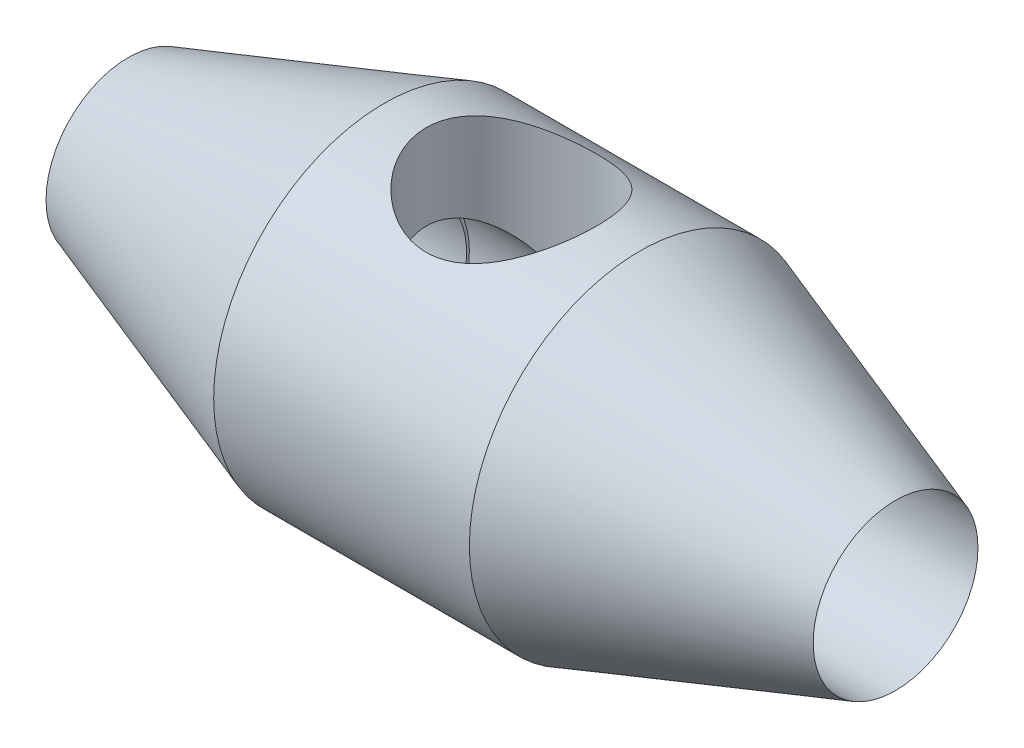
ISO-10303-21;
HEADER;
FILE_DESCRIPTION(('STEP AP214'),'2;1');
FILE_NAME('part.step','',(''),(''),'','','');
FILE_SCHEMA(('AUTOMOTIVE_DESIGN { 1 0 10303 214 1 1 1 1 }'));
ENDSEC;
DATA;
#1=APPLICATION_CONTEXT('core data for automotive mechanical design processes');
#2=APPLICATION_PROTOCOL_DEFINITION('international standard','automotive_design',2000,#1);
#3=PRODUCT_CONTEXT('',#1,'mechanical');
#4=PRODUCT('Part','Part','',(#3));
#5=PRODUCT_RELATED_PRODUCT_CATEGORY('part','',(#4));
#6=PRODUCT_DEFINITION_FORMATION('','',#4);
#7=PRODUCT_DEFINITION_CONTEXT('part definition',#1,'design');
#8=PRODUCT_DEFINITION('design','',#6,#7);
#9=PRODUCT_DEFINITION_SHAPE('','',#8);
#10=(LENGTH_UNIT() NAMED_UNIT(*) SI_UNIT(.MILLI.,.METRE.));
#11=(NAMED_UNIT(*) PLANE_ANGLE_UNIT() SI_UNIT($,.RADIAN.));
#12=(NAMED_UNIT(*) SI_UNIT($,.STERADIAN.) SOLID_ANGLE_UNIT());
#13=UNCERTAINTY_MEASURE_WITH_UNIT(LENGTH_MEASURE(1.E-05),#10,'distance_accuracy_value','');
#14=(GEOMETRIC_REPRESENTATION_CONTEXT(3) GLOBAL_UNCERTAINTY_ASSIGNED_CONTEXT((#13)) GLOBAL_UNIT_ASSIGNED_CONTEXT((#10,
#11,#12)) REPRESENTATION_CONTEXT('',''));
#15=CARTESIAN_POINT('',(0.,0.,0.));
#16=DIRECTION('',(0.,0.,1.));
#17=DIRECTION('',(1.,0.,0.));
#18=AXIS2_PLACEMENT_3D('',#15,#16,#17);
#19=CARTESIAN_POINT('',(76.2,0.,0.));
#20=DIRECTION('',(-1.,0.,0.));
#21=DIRECTION('',(0.,0.,1.));
#22=AXIS2_PLACEMENT_3D('',#19,#20,#21);
#23=CYLINDRICAL_SURFACE('',#22,25.4);
#24=CARTESIAN_POINT('',(37.928629542354,0.,0.));
#25=DIRECTION('',(-0.707106781186547,0.707106781186548,0.));
#26=DIRECTION('',(-0.707106781186547,-0.707106781186548,0.));
#27=AXIS2_PLACEMENT_3D('',#24,#25,#26);
#28=ELLIPSE('',#27,35.9210244842766,25.4);
#29=CARTESIAN_POINT('',(37.928629542354,0.,-25.4));
#30=VERTEX_POINT('',#29);
#31=CARTESIAN_POINT('',(37.928629542354,0.,25.4));
#32=VERTEX_POINT('',#31);
#33=EDGE_CURVE('E71',#30,#32,#28,.F.);
#34=ORIENTED_EDGE('',*,*,#33,.F.);
#35=CARTESIAN_POINT('',(37.928629542354,0.,0.));
#36=DIRECTION('',(-0.707106781186547,-0.707106781186548,0.));
#37=DIRECTION('',(-0.707106781186547,0.707106781186548,0.));
#38=AXIS2_PLACEMENT_3D('',#35,#36,#37);
#39=ELLIPSE('',#38,35.9210244842766,25.4);
#40=EDGE_CURVE('E62',#32,#30,#39,.F.);
#41=ORIENTED_EDGE('',*,*,#40,.F.);
#42=EDGE_LOOP('',(#34,#41));
#43=FACE_BOUND('',#42,.T.);
#44=CARTESIAN_POINT('',(76.2,0.,0.));
#45=DIRECTION('',(1.,0.,0.));
#46=DIRECTION('',(0.,0.,-1.));
#47=AXIS2_PLACEMENT_3D('',#44,#45,#46);
#48=CIRCLE('',#47,25.4);
#49=CARTESIAN_POINT('',(76.2,0.,-25.4));
#50=VERTEX_POINT('',#49);
#51=EDGE_CURVE('E103',#50,#50,#48,.T.);
#52=ORIENTED_EDGE('',*,*,#51,.T.);
#53=EDGE_LOOP('',(#52));
#54=FACE_BOUND('',#53,.T.);
#55=ADVANCED_FACE('F40',(#43,#54),#23,.F.);
#56=CARTESIAN_POINT('',(0.,0.,0.));
#57=DIRECTION('',(-1.,0.,0.));
#58=DIRECTION('',(0.,0.,1.));
#59=AXIS2_PLACEMENT_3D('',#56,#57,#58);
#60=PLANE('',#59);
#61=CARTESIAN_POINT('',(0.,0.,0.));
#62=DIRECTION('',(-1.,0.,0.));
#63=DIRECTION('',(0.,0.,1.));
#64=AXIS2_PLACEMENT_3D('',#61,#62,#63);
#65=CIRCLE('',#64,24.5622358673275);
#66=CARTESIAN_POINT('',(0.,0.,24.5622358673275));
#67=VERTEX_POINT('',#66);
#68=EDGE_CURVE('E95',#67,#67,#65,.T.);
#69=ORIENTED_EDGE('',*,*,#68,.T.);
#70=EDGE_LOOP('',(#69));
#71=FACE_BOUND('',#70,.T.);
#72=CARTESIAN_POINT('',(0.,0.,0.));
#73=DIRECTION('',(1.,0.,0.));
#74=DIRECTION('',(0.,0.,-1.));
#75=AXIS2_PLACEMENT_3D('',#72,#73,#74);
#76=CIRCLE('',#75,25.4);
#77=CARTESIAN_POINT('',(0.,0.,-25.4));
#78=VERTEX_POINT('',#77);
#79=EDGE_CURVE('E55',#78,#78,#76,.T.);
#80=ORIENTED_EDGE('',*,*,#79,.T.);
#81=EDGE_LOOP('',(#80));
#82=FACE_BOUND('',#81,.T.);
#83=ADVANCED_FACE('F132',(#71,#82),#60,.F.);
#84=CARTESIAN_POINT('',(37.928629542354,0.,0.));
#85=DIRECTION('',(-0.707106781186547,0.707106781186548,0.));
#86=DIRECTION('',(-0.707106781186547,-0.707106781186548,0.));
#87=AXIS2_PLACEMENT_3D('',#84,#85,#86);
#88=ELLIPSE('',#87,35.9210244842766,25.4);
#89=EDGE_CURVE('E75',#30,#32,#88,.T.);
#90=ORIENTED_EDGE('',*,*,#89,.F.);
#91=CARTESIAN_POINT('',(37.928629542354,0.,0.));
#92=DIRECTION('',(-0.707106781186547,-0.707106781186548,0.));
#93=DIRECTION('',(-0.707106781186547,0.707106781186548,0.));
#94=AXIS2_PLACEMENT_3D('',#91,#92,#93);
#95=ELLIPSE('',#94,35.9210244842766,25.4);
#96=EDGE_CURVE('E68',#32,#30,#95,.T.);
#97=ORIENTED_EDGE('',*,*,#96,.F.);
#98=EDGE_LOOP('',(#90,#97));
#99=FACE_BOUND('',#98,.T.);
#100=ORIENTED_EDGE('',*,*,#79,.F.);
#101=EDGE_LOOP('',(#100));
#102=FACE_BOUND('',#101,.T.);
#103=ADVANCED_FACE('F86',(#99,#102),#23,.F.);
#104=CARTESIAN_POINT('',(76.2,0.,0.));
#105=DIRECTION('',(1.,0.,0.));
#106=DIRECTION('',(0.,0.,-1.));
#107=AXIS2_PLACEMENT_3D('',#104,#105,#106);
#108=PLANE('',#107);
#109=CARTESIAN_POINT('',(76.2,0.,0.));
#110=DIRECTION('',(1.,0.,0.));
#111=DIRECTION('',(0.,0.,-1.));
#112=AXIS2_PLACEMENT_3D('',#109,#110,#111);
#113=CIRCLE('',#112,24.5622358673275);
#114=CARTESIAN_POINT('',(76.2,0.,-24.5622358673275));
#115=VERTEX_POINT('',#114);
#116=EDGE_CURVE('E94',#115,#115,#113,.T.);
#117=ORIENTED_EDGE('',*,*,#116,.T.);
#118=EDGE_LOOP('',(#117));
#119=FACE_BOUND('',#118,.T.);
#120=ORIENTED_EDGE('',*,*,#51,.F.);
#121=EDGE_LOOP('',(#120));
#122=FACE_BOUND('',#121,.T.);
#123=ADVANCED_FACE('F117',(#119,#122),#108,.F.);
#124=CARTESIAN_POINT('',(193.802,0.,0.));
#125=DIRECTION('',(-1.,0.,0.));
#126=DIRECTION('',(0.,0.,1.));
#127=AXIS2_PLACEMENT_3D('',#124,#125,#126);
#128=CYLINDRICAL_SURFACE('',#127,24.5622358673275);
#129=CARTESIAN_POINT('',(152.4,0.,0.));
#130=DIRECTION('',(1.,0.,0.));
#131=DIRECTION('',(0.,0.,-1.));
#132=AXIS2_PLACEMENT_3D('',#129,#130,#131);
#133=CIRCLE('',#132,24.5622358673275);
#134=CARTESIAN_POINT('',(152.4,0.,-24.5622358673275));
#135=VERTEX_POINT('',#134);
#136=EDGE_CURVE('E99',#135,#135,#133,.T.);
#137=ORIENTED_EDGE('',*,*,#136,.T.);
#138=EDGE_LOOP('',(#137));
#139=FACE_BOUND('',#138,.T.);
#140=ORIENTED_EDGE('',*,*,#116,.F.);
#141=EDGE_LOOP('',(#140));
#142=FACE_BOUND('',#141,.T.);
#143=ADVANCED_FACE('F120',(#139,#142),#128,.F.);
#144=CARTESIAN_POINT('',(-76.2,0.,0.));
#145=DIRECTION('',(-1.,0.,0.));
#146=DIRECTION('',(0.,0.,1.));
#147=AXIS2_PLACEMENT_3D('',#144,#145,#146);
#148=CIRCLE('',#147,24.5622358673275);
#149=CARTESIAN_POINT('',(-76.2,0.,24.5622358673275));
#150=VERTEX_POINT('',#149);
#151=EDGE_CURVE('E84',#150,#150,#148,.T.);
#152=ORIENTED_EDGE('',*,*,#151,.T.);
#153=EDGE_LOOP('',(#152));
#154=FACE_BOUND('',#153,.T.);
#155=ORIENTED_EDGE('',*,*,#68,.F.);
#156=EDGE_LOOP('',(#155));
#157=FACE_BOUND('',#156,.T.);
#158=ADVANCED_FACE('F122',(#154,#157),#128,.F.);
#159=CARTESIAN_POINT('',(76.2,0.,0.));
#160=DIRECTION('',(-1.,0.,0.));
#161=DIRECTION('',(0.,0.,1.));
#162=AXIS2_PLACEMENT_3D('',#159,#160,#161);
#163=CYLINDRICAL_SURFACE('',#162,50.8);
#164=CARTESIAN_POINT('',(37.928629542354,43.9940905122495,25.4));
#165=CARTESIAN_POINT('',(37.2665452906264,43.9940942797598,25.3999972052855));
#166=CARTESIAN_POINT('',(36.6044035951434,44.009087520774,25.3740783694391));
#167=CARTESIAN_POINT('',(35.285222445233,44.0685039086138,25.2707425722146));
#168=CARTESIAN_POINT('',(34.6281855102974,44.1129407565387,25.193301635804));
#169=CARTESIAN_POINT('',(33.3233771953834,44.2296878753547,24.987770157076));
#170=CARTESIAN_POINT('',(32.6756250653442,44.3020492279967,24.8595867814558));
#171=CARTESIAN_POINT('',(31.3952875514594,44.4720346202429,24.5541970944106));
#172=CARTESIAN_POINT('',(30.7627007204333,44.569656238764,24.3769954810513));
#173=CARTESIAN_POINT('',(29.5199203372696,44.7863135686149,23.9766048199614));
#174=CARTESIAN_POINT('',(28.9096249932652,44.9052317851629,23.7536671652355));
#175=CARTESIAN_POINT('',(27.7111401837302,45.161203127439,23.2633223400575));
#176=CARTESIAN_POINT('',(27.1229511780332,45.298256630131,22.9959142452037));
#177=CARTESIAN_POINT('',(25.9715608900478,45.5866301869932,22.4188118716329));
#178=CARTESIAN_POINT('',(25.40835384175,45.7379469236474,22.1091274185895));
#179=CARTESIAN_POINT('',(24.3089239219549,46.0510427395355,21.4493548394495));
#180=CARTESIAN_POINT('',(23.7727110681071,46.2128256526509,21.0992518703161));
#181=CARTESIAN_POINT('',(22.6865892919953,46.5565567541361,20.330239903397));
#182=CARTESIAN_POINT('',(22.1391870022151,46.7390685778231,19.9080392347499));
#183=CARTESIAN_POINT('',(21.0811325396675,47.1070278925488,19.0210010473163));
#184=CARTESIAN_POINT('',(20.5704822781485,47.2924755356507,18.5561613139878));
#185=CARTESIAN_POINT('',(19.588070131687,47.6618169326537,17.5858134785076));
#186=CARTESIAN_POINT('',(19.1163337892305,47.8457095959379,17.0802790883831));
#187=CARTESIAN_POINT('',(18.214817158393,48.2073018518021,16.0313350652322));
#188=CARTESIAN_POINT('',(17.7850228292049,48.3850035040309,15.4879382124511));
#189=CARTESIAN_POINT('',(16.9422246423224,48.7417035501529,14.3275668644523));
#190=CARTESIAN_POINT('',(16.5323318393398,48.9199739187532,13.7081017100292));
#191=CARTESIAN_POINT('',(15.7666048707996,49.2596953009187,12.4321460300159));
#192=CARTESIAN_POINT('',(15.4107738094564,49.4211453484972,11.77565338128));
#193=CARTESIAN_POINT('',(14.756847271988,49.7225030663339,10.4301336914315));
#194=CARTESIAN_POINT('',(14.4587238035062,49.8624211743542,9.74112262686789));
#195=CARTESIAN_POINT('',(13.9234375810518,50.1166011335952,8.33524588001212));
#196=CARTESIAN_POINT('',(13.6862683520163,50.2308657097828,7.61838316567328));
#197=CARTESIAN_POINT('',(13.2905564513869,50.4230794978228,6.21440507256291));
#198=CARTESIAN_POINT('',(13.1276207206639,50.5030338385641,5.52880120595195));
#199=CARTESIAN_POINT('',(12.859005646361,50.635485073204,4.14384022992904));
#200=CARTESIAN_POINT('',(12.7533238134011,50.6879831608878,3.44448371984776));
#201=CARTESIAN_POINT('',(12.60066439913,50.7639777321295,2.03818272904006));
#202=CARTESIAN_POINT('',(12.5536569021417,50.7874889948251,1.33124230064752));
#203=CARTESIAN_POINT('',(12.5189048373773,50.8048605421649,-0.0844401639379616));
#204=CARTESIAN_POINT('',(12.5311566438117,50.7987226408977,-0.793182087254194));
#205=CARTESIAN_POINT('',(12.611087968651,50.7588111322524,-2.14468802602041));
#206=CARTESIAN_POINT('',(12.6738477245763,50.727490691522,-2.78782284744986));
#207=CARTESIAN_POINT('',(12.8478634911943,50.6410812588994,-4.06583462434054));
#208=CARTESIAN_POINT('',(12.9591160875829,50.585993940398,-4.70071215794392));
#209=CARTESIAN_POINT('',(13.2289062327248,50.4533700760634,-5.95794250787339));
#210=CARTESIAN_POINT('',(13.3874453218376,50.3758327989244,-6.5802949154879));
#211=CARTESIAN_POINT('',(13.7501954603797,50.2001146614014,-7.80854772256009));
#212=CARTESIAN_POINT('',(13.9544081502252,50.101933059562,-8.41444753022832));
#213=CARTESIAN_POINT('',(14.4097188492633,49.8856541101048,-9.61448705517225));
#214=CARTESIAN_POINT('',(14.6614233525808,49.7673013040893,-10.2083502220876));
#215=CARTESIAN_POINT('',(15.207664865771,49.5142773479118,-11.3723851770355));
#216=CARTESIAN_POINT('',(15.5022018243314,49.379606217299,-11.9425569934489));
#217=CARTESIAN_POINT('',(16.1319784281505,49.096790454563,-13.0566289664039));
#218=CARTESIAN_POINT('',(16.4672281049321,48.948642504047,-13.6005226017256));
#219=CARTESIAN_POINT('',(17.1762006036858,48.641969109094,-14.6595645352729));
#220=CARTESIAN_POINT('',(17.5499265432399,48.4834428241205,-15.1747104989634));
#221=CARTESIAN_POINT('',(18.3708152039336,48.1439046324235,-16.2214386541337));
#222=CARTESIAN_POINT('',(18.8215803637458,47.9621838600723,-16.7499699410665));
#223=CARTESIAN_POINT('',(19.7640276893301,47.59458445396,-17.7676202035268));
#224=CARTESIAN_POINT('',(20.255712183194,47.4087055840659,-18.256736933456));
#225=CARTESIAN_POINT('',(21.277931999714,47.0372077204239,-19.1936230132773));
#226=CARTESIAN_POINT('',(21.8084953218279,46.8515890140537,-19.6413620288172));
#227=CARTESIAN_POINT('',(22.6311701712276,46.5770914572783,-20.2797501565215));
#228=CARTESIAN_POINT('',(22.9098775447485,46.4862440757543,-20.4870165015862));
#229=CARTESIAN_POINT('',(23.4760539111213,46.3064234804488,-20.8902821995818));
#230=CARTESIAN_POINT('',(23.7635256300307,46.2174508646503,-21.0862779910713));
#231=CARTESIAN_POINT('',(24.6755453429876,45.943163513119,-21.680961999562));
#232=CARTESIAN_POINT('',(25.3149400589904,45.7622484359526,-22.0592122624012));
#233=CARTESIAN_POINT('',(26.628110118775,45.4178447185897,-22.7598753274004));
#234=CARTESIAN_POINT('',(27.3018823935886,45.2543545268425,-23.0822931026099));
#235=CARTESIAN_POINT('',(28.3348785932204,45.0267388228068,-23.5214779715748));
#236=CARTESIAN_POINT('',(28.682866970173,44.95381541873,-23.6604442925108));
#237=CARTESIAN_POINT('',(29.3857074732062,44.8145381436513,-23.9231946889615));
#238=CARTESIAN_POINT('',(29.7405578202099,44.7481825964149,-24.0469826402032));
#239=CARTESIAN_POINT('',(30.8145839072961,44.559999752904,-24.3950064147826));
#240=CARTESIAN_POINT('',(31.5434306563491,44.449012425714,-24.5959856469434));
#241=CARTESIAN_POINT('',(32.9617011846933,44.2684462635174,-24.919393394954));
#242=CARTESIAN_POINT('',(33.6496757089866,44.1962841344099,-25.0467823102587));
#243=CARTESIAN_POINT('',(35.036389006613,44.0836457971715,-25.2445088975213));
#244=CARTESIAN_POINT('',(35.7351271693758,44.0431677984495,-25.3148497934887));
#245=CARTESIAN_POINT('',(37.1367375903827,43.9956451146112,-25.3973520995306));
#246=CARTESIAN_POINT('',(37.8396070938492,43.9885802312745,-25.4095486578794));
#247=CARTESIAN_POINT('',(39.2434419554333,44.0081388059857,-25.3756602023368));
#248=CARTESIAN_POINT('',(39.9444074388788,44.0347599900907,-25.3295791224169));
#249=CARTESIAN_POINT('',(41.2616709473722,44.1158166074523,-25.1881007973902));
#250=CARTESIAN_POINT('',(41.8788298403472,44.1668845158367,-25.0986609105172));
#251=CARTESIAN_POINT('',(43.1024644534514,44.2930952405557,-24.8752520992886));
#252=CARTESIAN_POINT('',(43.7089411143584,44.3682359255174,-24.7412871170888));
#253=CARTESIAN_POINT('',(44.9076960797224,44.5402660844437,-24.4302317766118));
#254=CARTESIAN_POINT('',(45.4999708750974,44.6371608734854,-24.2531308782419));
#255=CARTESIAN_POINT('',(46.6670199569794,44.8498624855971,-23.8574984081819));
#256=CARTESIAN_POINT('',(47.2417931732985,44.965670462428,-23.6389643088119));
#257=CARTESIAN_POINT('',(48.3971186929986,45.2187690991858,-23.1512805107251));
#258=CARTESIAN_POINT('',(48.9767192428546,45.3568032279334,-22.8802640247251));
#259=CARTESIAN_POINT('',(50.1114138743621,45.6464577476551,-22.2967931149771));
#260=CARTESIAN_POINT('',(50.6664973387654,45.7980839402791,-21.9843209686762));
#261=CARTESIAN_POINT('',(51.7498871385516,46.1111492285221,-21.3198688800087));
#262=CARTESIAN_POINT('',(52.2781826948869,46.2725922177014,-20.9678732142537));
#263=CARTESIAN_POINT('',(53.3055693607878,46.6014320536393,-20.2264906679959));
#264=CARTESIAN_POINT('',(53.8046699361498,46.7688269420116,-19.8371160161218));
#265=CARTESIAN_POINT('',(54.8331433253207,47.1272935349631,-18.9711517024974));
#266=CARTESIAN_POINT('',(55.3583708194717,47.3186839901137,-18.4897588085946));
#267=CARTESIAN_POINT('',(56.3669582025986,47.6994113445398,-17.4841422722716));
#268=CARTESIAN_POINT('',(56.8503148633927,47.8887480844941,-16.9599153334516));
#269=CARTESIAN_POINT('',(57.7725142024911,48.2605598482127,-15.8710240997006));
#270=CARTESIAN_POINT('',(58.2113411427813,48.4430324317583,-15.3063456275535));
#271=CARTESIAN_POINT('',(59.0413295086322,48.7963633848394,-14.1395352596565));
#272=CARTESIAN_POINT('',(59.4324914031817,48.9672218686418,-13.5374037325049));
#273=CARTESIAN_POINT('',(60.1737854747936,49.2971993655522,-12.2824297772424));
#274=CARTESIAN_POINT('',(60.522553434049,49.4558865441189,-11.6286656772484));
#275=CARTESIAN_POINT('',(61.1632058485985,49.7518320587747,-10.2891026764025));
#276=CARTESIAN_POINT('',(61.4550883974571,49.8890896766512,-9.6033027028673));
#277=CARTESIAN_POINT('',(61.9784477844589,50.1380173615895,-8.20506212715696));
#278=CARTESIAN_POINT('',(62.2099677734481,50.2497057001321,-7.49264097427209));
#279=CARTESIAN_POINT('',(62.6098579725056,50.4441517792394,-6.04645301265005));
#280=CARTESIAN_POINT('',(62.7782356709704,50.5269129503591,-5.31268874624094));
#281=CARTESIAN_POINT('',(63.0370109506326,50.6547078391375,-3.89840471081367));
#282=CARTESIAN_POINT('',(63.1331477574732,50.7025073021358,-3.21918002972945));
#283=CARTESIAN_POINT('',(63.2701757575959,50.7707632147996,-1.85382407184199));
#284=CARTESIAN_POINT('',(63.3110704570803,50.791221399808,-1.16769323615565));
#285=CARTESIAN_POINT('',(63.337078838633,50.8042240120159,0.205678892587523));
#286=CARTESIAN_POINT('',(63.322209139498,50.7967767555408,0.892919793805475));
#287=CARTESIAN_POINT('',(63.2369211377477,50.7541943989754,2.26306778182347));
#288=CARTESIAN_POINT('',(63.1665043643419,50.7190600611097,2.94597498740831));
#289=CARTESIAN_POINT('',(62.9774997416722,50.6252870132132,4.2571705513821));
#290=CARTESIAN_POINT('',(62.8623989338294,50.5683531339589,4.88608838226845));
#291=CARTESIAN_POINT('',(62.5857874774181,50.4325383131285,6.13116748733372));
#292=CARTESIAN_POINT('',(62.4242794489019,50.3536586105747,6.74732947957517));
#293=CARTESIAN_POINT('',(62.0564451369306,50.1757470246723,7.96316346645605));
#294=CARTESIAN_POINT('',(61.850115369303,50.0767135747304,8.56283417507735));
#295=CARTESIAN_POINT('',(61.3945107143506,49.8606795826594,9.74228666341959));
#296=CARTESIAN_POINT('',(61.1452338227155,49.7436782020081,10.3220675133807));
#297=CARTESIAN_POINT('',(60.5942274570762,49.488858666607,11.4830751032813));
#298=CARTESIAN_POINT('',(60.290712088796,49.3503647292747,12.0633054355103));
#299=CARTESIAN_POINT('',(59.641540317754,49.0596197048323,13.1960485483488));
#300=CARTESIAN_POINT('',(59.2958831263349,48.907368360275,13.748560809959));
#301=CARTESIAN_POINT('',(58.5646202785046,48.5923369405572,14.8235841330065));
#302=CARTESIAN_POINT('',(58.1790009114463,48.4295532590944,15.3460848015497));
#303=CARTESIAN_POINT('',(57.3701216383299,48.0969406445677,16.3587409302222));
#304=CARTESIAN_POINT('',(56.9468583342884,47.9271110762365,16.84889346343));
#305=CARTESIAN_POINT('',(56.0208931351384,47.5669044664744,17.8419626512028));
#306=CARTESIAN_POINT('',(55.5144778159649,47.3761651412227,18.3412913652872));
#307=CARTESIAN_POINT('',(54.4613996113415,46.9954413811512,19.2959226973437));
#308=CARTESIAN_POINT('',(53.9147337768749,46.8054570027208,19.7512220837738));
#309=CARTESIAN_POINT('',(52.7833405921411,46.4312089991145,20.6156469194578));
#310=CARTESIAN_POINT('',(52.1985783592432,46.2469508517084,21.0247290861758));
#311=CARTESIAN_POINT('',(50.9941738711277,45.8896281248552,21.7936176184244));
#312=CARTESIAN_POINT('',(50.3745342925914,45.7165626886021,22.153427758108));
#313=CARTESIAN_POINT('',(49.4113200323732,45.4668215843898,22.6593253966717));
#314=CARTESIAN_POINT('',(49.0792633874475,45.3840303058383,22.8245756328317));
#315=CARTESIAN_POINT('',(48.4072908023041,45.2236206225461,23.1407764625681));
#316=CARTESIAN_POINT('',(48.0673766968118,45.1460010263221,23.2917303532234));
#317=CARTESIAN_POINT('',(47.0363191706998,44.9219359681016,23.7226625329154));
#318=CARTESIAN_POINT('',(46.3338792750094,44.7842891632423,23.9807014730864));
#319=CARTESIAN_POINT('',(44.9064595654597,44.5384914634274,24.4341811668332));
#320=CARTESIAN_POINT('',(44.1815521243228,44.4302550039567,24.6298038059923));
#321=CARTESIAN_POINT('',(42.7135261946302,44.247551984237,24.9565506416791));
#322=CARTESIAN_POINT('',(41.9704208215717,44.1730618161337,25.0877199332152));
#323=CARTESIAN_POINT('',(40.6769195294298,44.0764949207776,25.2568615164128));
#324=CARTESIAN_POINT('',(40.1291624545719,44.0456684546932,25.310486978813));
#325=CARTESIAN_POINT('',(39.0304934989998,44.0044639988873,25.3820585768488));
#326=CARTESIAN_POINT('',(38.4795814097082,43.9940873771245,25.4000023256152));
#327=CARTESIAN_POINT('',(37.928629542354,43.9940905122495,25.4));
#328=B_SPLINE_CURVE_WITH_KNOTS('',3,(#164,#165,#166,#167,#168,#169,#170,#171,#172,#173,#174,
#175,#176,#177,#178,#179,#180,#181,#182,#183,#184,#185,#186,#187,#188,#189,#190,#191,#192,#193,
#194,#195,#196,#197,#198,#199,#200,#201,#202,#203,#204,#205,#206,#207,#208,#209,#210,#211,#212,
#213,#214,#215,#216,#217,#218,#219,#220,#221,#222,#223,#224,#225,#226,#227,#228,#229,#230,#231,
#232,#233,#234,#235,#236,#237,#238,#239,#240,#241,#242,#243,#244,#245,#246,#247,#248,#249,#250,
#251,#252,#253,#254,#255,#256,#257,#258,#259,#260,#261,#262,#263,#264,#265,#266,#267,#268,#269,
#270,#271,#272,#273,#274,#275,#276,#277,#278,#279,#280,#281,#282,#283,#284,#285,#286,#287,#288,
#289,#290,#291,#292,#293,#294,#295,#296,#297,#298,#299,#300,#301,#302,#303,#304,#305,#306,#307,
#308,#309,#310,#311,#312,#313,#314,#315,#316,#317,#318,#319,#320,#321,#322,#323,#324,#325,#326,
#327),.UNSPECIFIED.,.T.,.F.,(4,2,2,2,2,2,2,2,2,2,2,2,2,2,2,2,2,2,2,2,2,2,2,2,2,2,2,2,2,2,2,2,2,
2,2,2,2,2,2,2,2,2,2,2,2,2,2,2,2,2,2,2,2,2,2,2,2,2,2,2,2,2,2,2,2,2,2,2,2,2,2,2,2,2,2,2,2,2,2,2,2,
4),(0.,1.98568251354724,3.97228968138268,5.96254827032531,7.9526161725243,9.93202523071264,
11.9114754397843,13.8904663750579,15.8701863880098,18.012887628788,20.1557002179613,
22.2999083057326,24.4433961028264,26.7321256936806,29.0209866533048,31.308734552158,
33.5962393269867,35.7210183772871,37.8457050355001,39.9693079585998,42.0927809503748,
44.0313340646647,45.9697507105434,47.908230507321,49.8467799378561,51.8120046199212,
53.777226947706,55.7429344881245,57.7088014277107,59.8605337601895,62.0123885985532,
64.165808669064,65.2425981740472,66.3197260904587,68.6104724478329,70.9010146613139,
72.0458609047333,73.190414205455,75.4788710184455,77.5860892482373,79.693188382478,
81.7990136128354,83.9046966992334,85.77964039574,87.6544181329817,89.5296544252128,
91.4050051552101,93.3666766036721,95.3291893976004,97.2924857102114,99.2551419003368,
101.465829132239,103.676686653572,105.888322850336,108.09993728448,110.370239582388,
112.640617953244,114.909368841096,117.177850579968,119.238104484435,121.298227618975,
123.357736848457,125.417189381687,127.340681675057,129.264065393501,131.187598677768,
133.111221756233,135.117025092825,137.122865972507,139.129397330144,141.136109994371,
143.342616875463,145.549285580887,147.758004000247,149.966553140806,151.106306697804,
152.245796757023,154.524841837916,156.797183642039,159.067933322519,160.720203877153,
162.372584953967),.UNSPECIFIED.);
#329=CARTESIAN_POINT('',(37.928629542354,43.9940905122495,25.4));
#330=VERTEX_POINT('',#329);
#331=EDGE_CURVE('E45',#330,#330,#328,.T.);
#332=ORIENTED_EDGE('',*,*,#331,.T.);
#333=EDGE_LOOP('',(#332));
#334=FACE_BOUND('',#333,.T.);
#335=CARTESIAN_POINT('',(76.2,0.,0.));
#336=DIRECTION('',(1.,0.,0.));
#337=DIRECTION('',(0.,0.,-1.));
#338=AXIS2_PLACEMENT_3D('',#335,#336,#337);
#339=CIRCLE('',#338,50.8);
#340=CARTESIAN_POINT('',(76.2,0.,-50.8));
#341=VERTEX_POINT('',#340);
#342=EDGE_CURVE('E11',#341,#341,#339,.T.);
#343=ORIENTED_EDGE('',*,*,#342,.F.);
#344=EDGE_LOOP('',(#343));
#345=FACE_BOUND('',#344,.T.);
#346=CARTESIAN_POINT('',(0.,0.,0.));
#347=DIRECTION('',(-1.,0.,0.));
#348=DIRECTION('',(0.,0.,1.));
#349=AXIS2_PLACEMENT_3D('',#346,#347,#348);
#350=CIRCLE('',#349,50.8);
#351=CARTESIAN_POINT('',(0.,0.,50.8));
#352=VERTEX_POINT('',#351);
#353=EDGE_CURVE('E104',#352,#352,#350,.T.);
#354=ORIENTED_EDGE('',*,*,#353,.F.);
#355=EDGE_LOOP('',(#354));
#356=FACE_BOUND('',#355,.T.);
#357=ADVANCED_FACE('F42',(#334,#345,#356),#163,.T.);
#358=CARTESIAN_POINT('',(0.,0.,0.));
#359=DIRECTION('',(1.,0.,0.));
#360=DIRECTION('',(0.,0.,1.));
#361=AXIS2_PLACEMENT_3D('',#358,#359,#360);
#362=CONICAL_SURFACE('',#361,50.8,0.331612557878923);
#363=ORIENTED_EDGE('',*,*,#151,.F.);
#364=EDGE_LOOP('',(#363));
#365=FACE_BOUND('',#364,.T.);
#366=ORIENTED_EDGE('',*,*,#353,.T.);
#367=EDGE_LOOP('',(#366));
#368=FACE_BOUND('',#367,.T.);
#369=ADVANCED_FACE('F200',(#365,#368),#362,.T.);
#370=CARTESIAN_POINT('',(76.2,0.,0.));
#371=DIRECTION('',(-1.,0.,0.));
#372=DIRECTION('',(0.,0.,-1.));
#373=AXIS2_PLACEMENT_3D('',#370,#371,#372);
#374=CONICAL_SURFACE('',#373,50.8,0.331612557878923);
#375=ORIENTED_EDGE('',*,*,#136,.F.);
#376=EDGE_LOOP('',(#375));
#377=FACE_BOUND('',#376,.T.);
#378=ORIENTED_EDGE('',*,*,#342,.T.);
#379=EDGE_LOOP('',(#378));
#380=FACE_BOUND('',#379,.T.);
#381=ADVANCED_FACE('F178',(#377,#380),#374,.T.);
#382=CARTESIAN_POINT('',(37.928629542354,-41.4020000000003,0.));
#383=DIRECTION('',(0.,1.,0.));
#384=DIRECTION('',(0.,0.,1.));
#385=AXIS2_PLACEMENT_3D('',#382,#383,#384);
#386=CYLINDRICAL_SURFACE('',#385,25.4);
#387=ORIENTED_EDGE('',*,*,#33,.T.);
#388=ORIENTED_EDGE('',*,*,#96,.T.);
#389=EDGE_LOOP('',(#387,#388));
#390=FACE_BOUND('',#389,.T.);
#391=ORIENTED_EDGE('',*,*,#331,.F.);
#392=EDGE_LOOP('',(#391));
#393=FACE_BOUND('',#392,.T.);
#394=ADVANCED_FACE('F69',(#390,#393),#386,.F.);
#395=ORIENTED_EDGE('',*,*,#89,.T.);
#396=ORIENTED_EDGE('',*,*,#40,.T.);
#397=EDGE_LOOP('',(#395,#396));
#398=FACE_BOUND('',#397,.T.);
#399=CARTESIAN_POINT('',(37.928629542354,-41.4020000000003,0.));
#400=DIRECTION('',(0.,1.,0.));
#401=DIRECTION('',(0.,0.,1.));
#402=AXIS2_PLACEMENT_3D('',#399,#400,#401);
#403=CIRCLE('',#402,25.4);
#404=CARTESIAN_POINT('',(37.928629542354,-41.4020000000003,25.4));
#405=VERTEX_POINT('',#404);
#406=EDGE_CURVE('E232',#405,#405,#403,.T.);
#407=ORIENTED_EDGE('',*,*,#406,.F.);
#408=EDGE_LOOP('',(#407));
#409=FACE_BOUND('',#408,.T.);
#410=ADVANCED_FACE('F78',(#398,#409),#386,.F.);
#411=CARTESIAN_POINT('',(37.928629542354,-41.4020000000003,0.));
#412=DIRECTION('',(0.,1.,0.));
#413=DIRECTION('',(0.,0.,1.));
#414=AXIS2_PLACEMENT_3D('',#411,#412,#413);
#415=PLANE('',#414);
#416=ORIENTED_EDGE('',*,*,#406,.T.);
#417=EDGE_LOOP('',(#416));
#418=FACE_BOUND('',#417,.T.);
#419=ADVANCED_FACE('F185',(#418),#415,.T.);
#420=CLOSED_SHELL('',(#55,#83,#103,#123,#143,#158,#357,#369,#381,#394,#410,#419));
#421=MANIFOLD_SOLID_BREP('B2',#420);
#422=ADVANCED_BREP_SHAPE_REPRESENTATION('',(#18,#421),#14);
#423=SHAPE_DEFINITION_REPRESENTATION(#9,#422);
ENDSEC;
END-ISO-10303-21;
